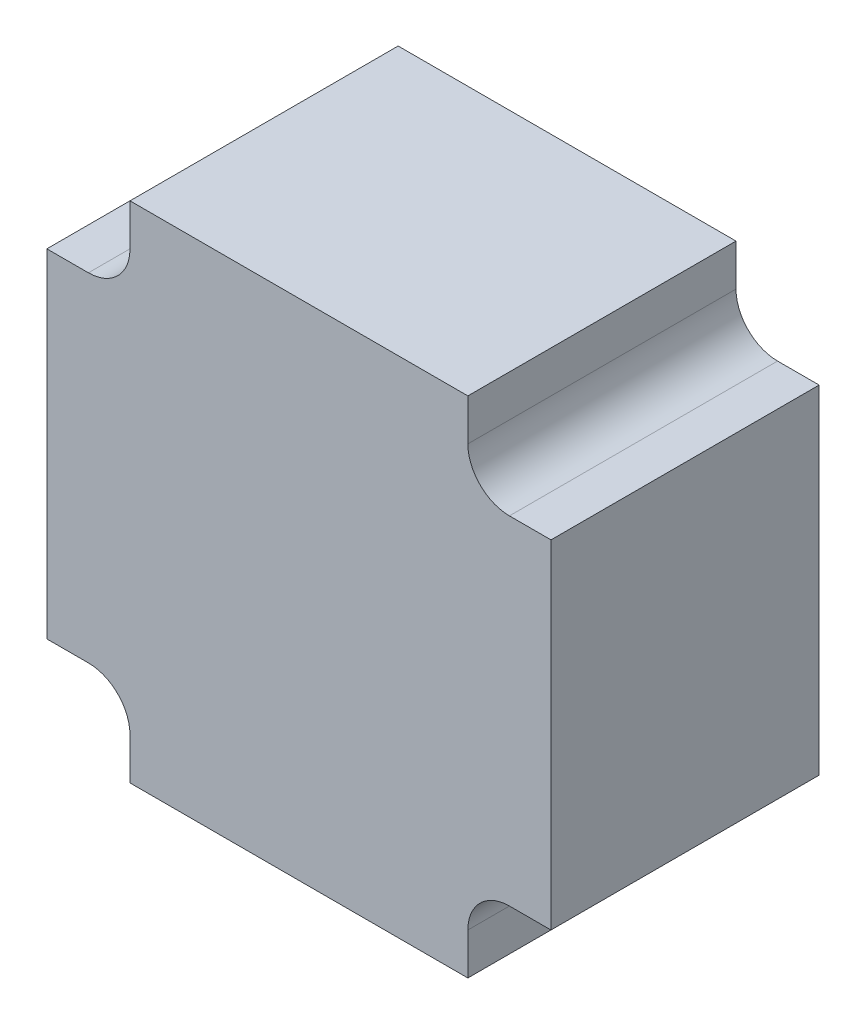
ISO-10303-21;
HEADER;
FILE_DESCRIPTION(('STEP AP214'),'2;1');
FILE_NAME('part.step','',(''),(''),'','','');
FILE_SCHEMA(('AUTOMOTIVE_DESIGN { 1 0 10303 214 1 1 1 1 }'));
ENDSEC;
DATA;
#1=APPLICATION_CONTEXT('core data for automotive mechanical design processes');
#2=APPLICATION_PROTOCOL_DEFINITION('international standard','automotive_design',2000,#1);
#3=PRODUCT_CONTEXT('',#1,'mechanical');
#4=PRODUCT('Part','Part','',(#3));
#5=PRODUCT_RELATED_PRODUCT_CATEGORY('part','',(#4));
#6=PRODUCT_DEFINITION_FORMATION('','',#4);
#7=PRODUCT_DEFINITION_CONTEXT('part definition',#1,'design');
#8=PRODUCT_DEFINITION('design','',#6,#7);
#9=PRODUCT_DEFINITION_SHAPE('','',#8);
#10=(LENGTH_UNIT() NAMED_UNIT(*) SI_UNIT(.MILLI.,.METRE.));
#11=(NAMED_UNIT(*) PLANE_ANGLE_UNIT() SI_UNIT($,.RADIAN.));
#12=(NAMED_UNIT(*) SI_UNIT($,.STERADIAN.) SOLID_ANGLE_UNIT());
#13=UNCERTAINTY_MEASURE_WITH_UNIT(LENGTH_MEASURE(1.E-05),#10,'distance_accuracy_value','');
#14=(GEOMETRIC_REPRESENTATION_CONTEXT(3) GLOBAL_UNCERTAINTY_ASSIGNED_CONTEXT((#13)) GLOBAL_UNIT_ASSIGNED_CONTEXT((#10,
#11,#12)) REPRESENTATION_CONTEXT('',''));
#15=CARTESIAN_POINT('',(0.,0.,0.));
#16=DIRECTION('',(0.,0.,1.));
#17=DIRECTION('',(1.,0.,0.));
#18=AXIS2_PLACEMENT_3D('',#15,#16,#17);
#19=CARTESIAN_POINT('',(28.2,-28.2,-12.));
#20=DIRECTION('',(0.,0.,1.));
#21=DIRECTION('',(1.,0.,0.));
#22=AXIS2_PLACEMENT_3D('',#19,#20,#21);
#23=PLANE('',#22);
#24=DIRECTION('',(1.,0.,0.));
#25=VECTOR('',#24,1.);
#26=CARTESIAN_POINT('',(-28.2,28.2,-12.));
#27=LINE('',#26,#25);
#28=CARTESIAN_POINT('',(-18.9,28.2,-12.));
#29=VERTEX_POINT('',#28);
#30=CARTESIAN_POINT('',(18.9,28.2,-12.));
#31=VERTEX_POINT('',#30);
#32=EDGE_CURVE('E108',#29,#31,#27,.T.);
#33=ORIENTED_EDGE('',*,*,#32,.F.);
#34=DIRECTION('',(0.,1.,0.));
#35=VECTOR('',#34,1.);
#36=CARTESIAN_POINT('',(-18.9,23.55,-12.));
#37=LINE('',#36,#35);
#38=CARTESIAN_POINT('',(-18.9,23.55,-12.));
#39=VERTEX_POINT('',#38);
#40=EDGE_CURVE('E111',#29,#39,#37,.F.);
#41=ORIENTED_EDGE('',*,*,#40,.T.);
#42=CARTESIAN_POINT('',(-23.55,23.55,-12.));
#43=DIRECTION('',(0.,0.,-1.));
#44=DIRECTION('',(-1.,0.,0.));
#45=AXIS2_PLACEMENT_3D('',#42,#43,#44);
#46=CIRCLE('',#45,4.65);
#47=CARTESIAN_POINT('',(-23.55,18.9,-12.));
#48=VERTEX_POINT('',#47);
#49=EDGE_CURVE('E211',#39,#48,#46,.T.);
#50=ORIENTED_EDGE('',*,*,#49,.T.);
#51=DIRECTION('',(1.,0.,0.));
#52=VECTOR('',#51,1.);
#53=CARTESIAN_POINT('',(-23.55,18.9,-12.));
#54=LINE('',#53,#52);
#55=CARTESIAN_POINT('',(-28.2,18.9,-12.));
#56=VERTEX_POINT('',#55);
#57=EDGE_CURVE('E136',#48,#56,#54,.F.);
#58=ORIENTED_EDGE('',*,*,#57,.T.);
#59=DIRECTION('',(0.,1.,0.));
#60=VECTOR('',#59,1.);
#61=CARTESIAN_POINT('',(-28.2,-28.2,-12.));
#62=LINE('',#61,#60);
#63=CARTESIAN_POINT('',(-28.2,-18.9,-12.));
#64=VERTEX_POINT('',#63);
#65=EDGE_CURVE('E140',#64,#56,#62,.T.);
#66=ORIENTED_EDGE('',*,*,#65,.F.);
#67=DIRECTION('',(1.,0.,0.));
#68=VECTOR('',#67,1.);
#69=CARTESIAN_POINT('',(-23.55,-18.9,-12.));
#70=LINE('',#69,#68);
#71=CARTESIAN_POINT('',(-23.55,-18.9,-12.));
#72=VERTEX_POINT('',#71);
#73=EDGE_CURVE('E148',#64,#72,#70,.T.);
#74=ORIENTED_EDGE('',*,*,#73,.T.);
#75=CARTESIAN_POINT('',(-23.55,-23.55,-12.));
#76=DIRECTION('',(0.,0.,-1.));
#77=DIRECTION('',(-1.,0.,0.));
#78=AXIS2_PLACEMENT_3D('',#75,#76,#77);
#79=CIRCLE('',#78,4.65);
#80=CARTESIAN_POINT('',(-18.9,-23.55,-12.));
#81=VERTEX_POINT('',#80);
#82=EDGE_CURVE('E213',#72,#81,#79,.T.);
#83=ORIENTED_EDGE('',*,*,#82,.T.);
#84=DIRECTION('',(0.,1.,0.));
#85=VECTOR('',#84,1.);
#86=CARTESIAN_POINT('',(-18.9,-23.55,-12.));
#87=LINE('',#86,#85);
#88=CARTESIAN_POINT('',(-18.9,-28.2,-12.));
#89=VERTEX_POINT('',#88);
#90=EDGE_CURVE('E154',#81,#89,#87,.F.);
#91=ORIENTED_EDGE('',*,*,#90,.T.);
#92=DIRECTION('',(1.,0.,0.));
#93=VECTOR('',#92,1.);
#94=CARTESIAN_POINT('',(-28.2,-28.2,-12.));
#95=LINE('',#94,#93);
#96=CARTESIAN_POINT('',(18.9,-28.2,-12.));
#97=VERTEX_POINT('',#96);
#98=EDGE_CURVE('E158',#97,#89,#95,.F.);
#99=ORIENTED_EDGE('',*,*,#98,.F.);
#100=DIRECTION('',(0.,1.,0.));
#101=VECTOR('',#100,1.);
#102=CARTESIAN_POINT('',(18.9,-23.55,-12.));
#103=LINE('',#102,#101);
#104=CARTESIAN_POINT('',(18.9,-23.55,-12.));
#105=VERTEX_POINT('',#104);
#106=EDGE_CURVE('E166',#97,#105,#103,.T.);
#107=ORIENTED_EDGE('',*,*,#106,.T.);
#108=CARTESIAN_POINT('',(23.55,-23.55,-12.));
#109=DIRECTION('',(0.,0.,-1.));
#110=DIRECTION('',(-1.,0.,0.));
#111=AXIS2_PLACEMENT_3D('',#108,#109,#110);
#112=CIRCLE('',#111,4.65);
#113=CARTESIAN_POINT('',(23.55,-18.9,-12.));
#114=VERTEX_POINT('',#113);
#115=EDGE_CURVE('E214',#105,#114,#112,.T.);
#116=ORIENTED_EDGE('',*,*,#115,.T.);
#117=DIRECTION('',(1.,0.,0.));
#118=VECTOR('',#117,1.);
#119=CARTESIAN_POINT('',(23.55,-18.9,-12.));
#120=LINE('',#119,#118);
#121=CARTESIAN_POINT('',(28.2,-18.9,-12.));
#122=VERTEX_POINT('',#121);
#123=EDGE_CURVE('E172',#114,#122,#120,.T.);
#124=ORIENTED_EDGE('',*,*,#123,.T.);
#125=DIRECTION('',(0.,1.,0.));
#126=VECTOR('',#125,1.);
#127=CARTESIAN_POINT('',(28.2,-28.2,-12.));
#128=LINE('',#127,#126);
#129=CARTESIAN_POINT('',(28.2,18.9,-12.));
#130=VERTEX_POINT('',#129);
#131=EDGE_CURVE('E176',#130,#122,#128,.F.);
#132=ORIENTED_EDGE('',*,*,#131,.F.);
#133=DIRECTION('',(1.,0.,0.));
#134=VECTOR('',#133,1.);
#135=CARTESIAN_POINT('',(23.55,18.9,-12.));
#136=LINE('',#135,#134);
#137=CARTESIAN_POINT('',(23.55,18.9,-12.));
#138=VERTEX_POINT('',#137);
#139=EDGE_CURVE('E97',#130,#138,#136,.F.);
#140=ORIENTED_EDGE('',*,*,#139,.T.);
#141=CARTESIAN_POINT('',(23.55,23.55,-12.));
#142=DIRECTION('',(0.,0.,-1.));
#143=DIRECTION('',(-1.,0.,0.));
#144=AXIS2_PLACEMENT_3D('',#141,#142,#143);
#145=CIRCLE('',#144,4.65);
#146=CARTESIAN_POINT('',(18.9,23.55,-12.));
#147=VERTEX_POINT('',#146);
#148=EDGE_CURVE('E20',#138,#147,#145,.T.);
#149=ORIENTED_EDGE('',*,*,#148,.T.);
#150=DIRECTION('',(0.,1.,0.));
#151=VECTOR('',#150,1.);
#152=CARTESIAN_POINT('',(18.9,23.55,-12.));
#153=LINE('',#152,#151);
#154=EDGE_CURVE('E105',#147,#31,#153,.T.);
#155=ORIENTED_EDGE('',*,*,#154,.T.);
#156=EDGE_LOOP('',(#33,#41,#50,#58,#66,#74,#83,#91,#99,#107,#116,#124,#132,#140,#149,#155));
#157=FACE_BOUND('',#156,.T.);
#158=ADVANCED_FACE('F17',(#157),#23,.T.);
#159=CARTESIAN_POINT('',(-28.2,28.2,-54.));
#160=DIRECTION('',(0.,1.,0.));
#161=DIRECTION('',(0.,0.,1.));
#162=AXIS2_PLACEMENT_3D('',#159,#160,#161);
#163=PLANE('',#162);
#164=ORIENTED_EDGE('',*,*,#32,.T.);
#165=DIRECTION('',(0.,0.,1.));
#166=VECTOR('',#165,1.);
#167=CARTESIAN_POINT('',(18.9,28.2,-4.8));
#168=LINE('',#167,#166);
#169=CARTESIAN_POINT('',(18.9,28.2,-42.));
#170=VERTEX_POINT('',#169);
#171=EDGE_CURVE('E190',#31,#170,#168,.F.);
#172=ORIENTED_EDGE('',*,*,#171,.T.);
#173=DIRECTION('',(-1.,0.,0.));
#174=VECTOR('',#173,1.);
#175=CARTESIAN_POINT('',(28.2,28.2,-42.));
#176=LINE('',#175,#174);
#177=CARTESIAN_POINT('',(-18.9,28.2,-42.));
#178=VERTEX_POINT('',#177);
#179=EDGE_CURVE('E121',#178,#170,#176,.F.);
#180=ORIENTED_EDGE('',*,*,#179,.F.);
#181=DIRECTION('',(0.,0.,-1.));
#182=VECTOR('',#181,1.);
#183=CARTESIAN_POINT('',(-18.9,28.2,-4.8));
#184=LINE('',#183,#182);
#185=EDGE_CURVE('E118',#178,#29,#184,.F.);
#186=ORIENTED_EDGE('',*,*,#185,.T.);
#187=EDGE_LOOP('',(#164,#172,#180,#186));
#188=FACE_BOUND('',#187,.T.);
#189=ADVANCED_FACE('F119',(#188),#163,.T.);
#190=CARTESIAN_POINT('',(18.9,23.55,-4.8));
#191=DIRECTION('',(-1.,0.,0.));
#192=DIRECTION('',(0.,0.,1.));
#193=AXIS2_PLACEMENT_3D('',#190,#191,#192);
#194=PLANE('',#193);
#195=ORIENTED_EDGE('',*,*,#154,.F.);
#196=DIRECTION('',(0.,0.,-1.));
#197=VECTOR('',#196,1.);
#198=CARTESIAN_POINT('',(18.9,23.55,-4.8));
#199=LINE('',#198,#197);
#200=CARTESIAN_POINT('',(18.9,23.55,-42.));
#201=VERTEX_POINT('',#200);
#202=EDGE_CURVE('E186',#147,#201,#199,.T.);
#203=ORIENTED_EDGE('',*,*,#202,.T.);
#204=DIRECTION('',(0.,1.,0.));
#205=VECTOR('',#204,1.);
#206=CARTESIAN_POINT('',(18.9,-28.2,-42.));
#207=LINE('',#206,#205);
#208=EDGE_CURVE('E210',#170,#201,#207,.F.);
#209=ORIENTED_EDGE('',*,*,#208,.F.);
#210=ORIENTED_EDGE('',*,*,#171,.F.);
#211=EDGE_LOOP('',(#195,#203,#209,#210));
#212=FACE_BOUND('',#211,.T.);
#213=ADVANCED_FACE('F241',(#212),#194,.F.);
#214=CARTESIAN_POINT('',(23.55,23.55,-4.8));
#215=DIRECTION('',(0.,0.,-1.));
#216=DIRECTION('',(-1.,0.,0.));
#217=AXIS2_PLACEMENT_3D('',#214,#215,#216);
#218=CYLINDRICAL_SURFACE('',#217,4.65);
#219=ORIENTED_EDGE('',*,*,#148,.F.);
#220=DIRECTION('',(0.,0.,-1.));
#221=VECTOR('',#220,1.);
#222=CARTESIAN_POINT('',(23.55,18.9,-4.8));
#223=LINE('',#222,#221);
#224=CARTESIAN_POINT('',(23.55,18.9,-42.));
#225=VERTEX_POINT('',#224);
#226=EDGE_CURVE('E185',#138,#225,#223,.T.);
#227=ORIENTED_EDGE('',*,*,#226,.T.);
#228=CARTESIAN_POINT('',(23.55,23.55,-42.));
#229=DIRECTION('',(0.,0.,-1.));
#230=DIRECTION('',(-1.,0.,0.));
#231=AXIS2_PLACEMENT_3D('',#228,#229,#230);
#232=CIRCLE('',#231,4.65);
#233=EDGE_CURVE('E206',#201,#225,#232,.F.);
#234=ORIENTED_EDGE('',*,*,#233,.F.);
#235=ORIENTED_EDGE('',*,*,#202,.F.);
#236=EDGE_LOOP('',(#219,#227,#234,#235));
#237=FACE_BOUND('',#236,.T.);
#238=ADVANCED_FACE('F323',(#237),#218,.F.);
#239=CARTESIAN_POINT('',(23.55,18.9,-4.8));
#240=DIRECTION('',(0.,-1.,0.));
#241=DIRECTION('',(0.,0.,-1.));
#242=AXIS2_PLACEMENT_3D('',#239,#240,#241);
#243=PLANE('',#242);
#244=ORIENTED_EDGE('',*,*,#139,.F.);
#245=DIRECTION('',(0.,0.,-1.));
#246=VECTOR('',#245,1.);
#247=CARTESIAN_POINT('',(28.2,18.9,-54.));
#248=LINE('',#247,#246);
#249=CARTESIAN_POINT('',(28.2,18.9,-42.));
#250=VERTEX_POINT('',#249);
#251=EDGE_CURVE('E181',#250,#130,#248,.F.);
#252=ORIENTED_EDGE('',*,*,#251,.F.);
#253=DIRECTION('',(-1.,0.,0.));
#254=VECTOR('',#253,1.);
#255=CARTESIAN_POINT('',(28.2,18.9,-42.));
#256=LINE('',#255,#254);
#257=EDGE_CURVE('E209',#225,#250,#256,.F.);
#258=ORIENTED_EDGE('',*,*,#257,.F.);
#259=ORIENTED_EDGE('',*,*,#226,.F.);
#260=EDGE_LOOP('',(#244,#252,#258,#259));
#261=FACE_BOUND('',#260,.T.);
#262=ADVANCED_FACE('F312',(#261),#243,.F.);
#263=CARTESIAN_POINT('',(28.2,-28.2,-54.));
#264=DIRECTION('',(1.,0.,0.));
#265=DIRECTION('',(0.,0.,-1.));
#266=AXIS2_PLACEMENT_3D('',#263,#264,#265);
#267=PLANE('',#266);
#268=ORIENTED_EDGE('',*,*,#131,.T.);
#269=DIRECTION('',(0.,0.,1.));
#270=VECTOR('',#269,1.);
#271=CARTESIAN_POINT('',(28.2,-18.9,-4.8));
#272=LINE('',#271,#270);
#273=CARTESIAN_POINT('',(28.2,-18.9,-42.));
#274=VERTEX_POINT('',#273);
#275=EDGE_CURVE('E175',#122,#274,#272,.F.);
#276=ORIENTED_EDGE('',*,*,#275,.T.);
#277=DIRECTION('',(0.,1.,0.));
#278=VECTOR('',#277,1.);
#279=CARTESIAN_POINT('',(28.2,-28.2,-42.));
#280=LINE('',#279,#278);
#281=EDGE_CURVE('E228',#250,#274,#280,.F.);
#282=ORIENTED_EDGE('',*,*,#281,.F.);
#283=ORIENTED_EDGE('',*,*,#251,.T.);
#284=EDGE_LOOP('',(#268,#276,#282,#283));
#285=FACE_BOUND('',#284,.T.);
#286=ADVANCED_FACE('F313',(#285),#267,.T.);
#287=CARTESIAN_POINT('',(23.55,-18.9,-4.8));
#288=DIRECTION('',(0.,1.,0.));
#289=DIRECTION('',(0.,0.,1.));
#290=AXIS2_PLACEMENT_3D('',#287,#288,#289);
#291=PLANE('',#290);
#292=ORIENTED_EDGE('',*,*,#123,.F.);
#293=DIRECTION('',(0.,0.,-1.));
#294=VECTOR('',#293,1.);
#295=CARTESIAN_POINT('',(23.55,-18.9,-4.8));
#296=LINE('',#295,#294);
#297=CARTESIAN_POINT('',(23.55,-18.9,-42.));
#298=VERTEX_POINT('',#297);
#299=EDGE_CURVE('E169',#114,#298,#296,.T.);
#300=ORIENTED_EDGE('',*,*,#299,.T.);
#301=DIRECTION('',(-1.,0.,0.));
#302=VECTOR('',#301,1.);
#303=CARTESIAN_POINT('',(28.2,-18.9,-42.));
#304=LINE('',#303,#302);
#305=EDGE_CURVE('E205',#274,#298,#304,.T.);
#306=ORIENTED_EDGE('',*,*,#305,.F.);
#307=ORIENTED_EDGE('',*,*,#275,.F.);
#308=EDGE_LOOP('',(#292,#300,#306,#307));
#309=FACE_BOUND('',#308,.T.);
#310=ADVANCED_FACE('F315',(#309),#291,.F.);
#311=CARTESIAN_POINT('',(23.55,-23.55,-4.8));
#312=DIRECTION('',(0.,0.,-1.));
#313=DIRECTION('',(-1.,0.,0.));
#314=AXIS2_PLACEMENT_3D('',#311,#312,#313);
#315=CYLINDRICAL_SURFACE('',#314,4.65);
#316=ORIENTED_EDGE('',*,*,#115,.F.);
#317=DIRECTION('',(0.,0.,1.));
#318=VECTOR('',#317,1.);
#319=CARTESIAN_POINT('',(18.9,-23.55,-4.8));
#320=LINE('',#319,#318);
#321=CARTESIAN_POINT('',(18.9,-23.55,-42.));
#322=VERTEX_POINT('',#321);
#323=EDGE_CURVE('E168',#105,#322,#320,.F.);
#324=ORIENTED_EDGE('',*,*,#323,.T.);
#325=CARTESIAN_POINT('',(23.55,-23.55,-42.));
#326=DIRECTION('',(0.,0.,-1.));
#327=DIRECTION('',(-1.,0.,0.));
#328=AXIS2_PLACEMENT_3D('',#325,#326,#327);
#329=CIRCLE('',#328,4.65);
#330=EDGE_CURVE('E201',#298,#322,#329,.F.);
#331=ORIENTED_EDGE('',*,*,#330,.F.);
#332=ORIENTED_EDGE('',*,*,#299,.F.);
#333=EDGE_LOOP('',(#316,#324,#331,#332));
#334=FACE_BOUND('',#333,.T.);
#335=ADVANCED_FACE('F285',(#334),#315,.F.);
#336=CARTESIAN_POINT('',(18.9,-23.55,-4.8));
#337=DIRECTION('',(-1.,0.,0.));
#338=DIRECTION('',(0.,0.,1.));
#339=AXIS2_PLACEMENT_3D('',#336,#337,#338);
#340=PLANE('',#339);
#341=ORIENTED_EDGE('',*,*,#106,.F.);
#342=DIRECTION('',(0.,0.,-1.));
#343=VECTOR('',#342,1.);
#344=CARTESIAN_POINT('',(18.9,-28.2,-54.));
#345=LINE('',#344,#343);
#346=CARTESIAN_POINT('',(18.9,-28.2,-42.));
#347=VERTEX_POINT('',#346);
#348=EDGE_CURVE('E163',#347,#97,#345,.F.);
#349=ORIENTED_EDGE('',*,*,#348,.F.);
#350=DIRECTION('',(0.,1.,0.));
#351=VECTOR('',#350,1.);
#352=CARTESIAN_POINT('',(18.9,-28.2,-42.));
#353=LINE('',#352,#351);
#354=EDGE_CURVE('E204',#322,#347,#353,.F.);
#355=ORIENTED_EDGE('',*,*,#354,.F.);
#356=ORIENTED_EDGE('',*,*,#323,.F.);
#357=EDGE_LOOP('',(#341,#349,#355,#356));
#358=FACE_BOUND('',#357,.T.);
#359=ADVANCED_FACE('F292',(#358),#340,.F.);
#360=CARTESIAN_POINT('',(-28.2,-28.2,-54.));
#361=DIRECTION('',(0.,-1.,0.));
#362=DIRECTION('',(0.,0.,-1.));
#363=AXIS2_PLACEMENT_3D('',#360,#361,#362);
#364=PLANE('',#363);
#365=ORIENTED_EDGE('',*,*,#98,.T.);
#366=DIRECTION('',(0.,0.,-1.));
#367=VECTOR('',#366,1.);
#368=CARTESIAN_POINT('',(-18.9,-28.2,-4.8));
#369=LINE('',#368,#367);
#370=CARTESIAN_POINT('',(-18.9,-28.2,-42.));
#371=VERTEX_POINT('',#370);
#372=EDGE_CURVE('E157',#89,#371,#369,.T.);
#373=ORIENTED_EDGE('',*,*,#372,.T.);
#374=DIRECTION('',(-1.,0.,0.));
#375=VECTOR('',#374,1.);
#376=CARTESIAN_POINT('',(28.2,-28.2,-42.));
#377=LINE('',#376,#375);
#378=EDGE_CURVE('E273',#347,#371,#377,.T.);
#379=ORIENTED_EDGE('',*,*,#378,.F.);
#380=ORIENTED_EDGE('',*,*,#348,.T.);
#381=EDGE_LOOP('',(#365,#373,#379,#380));
#382=FACE_BOUND('',#381,.T.);
#383=ADVANCED_FACE('F354',(#382),#364,.T.);
#384=CARTESIAN_POINT('',(-18.9,-23.55,-4.8));
#385=DIRECTION('',(1.,0.,0.));
#386=DIRECTION('',(0.,0.,-1.));
#387=AXIS2_PLACEMENT_3D('',#384,#385,#386);
#388=PLANE('',#387);
#389=ORIENTED_EDGE('',*,*,#90,.F.);
#390=DIRECTION('',(0.,0.,-1.));
#391=VECTOR('',#390,1.);
#392=CARTESIAN_POINT('',(-18.9,-23.55,-4.8));
#393=LINE('',#392,#391);
#394=CARTESIAN_POINT('',(-18.9,-23.55,-42.));
#395=VERTEX_POINT('',#394);
#396=EDGE_CURVE('E151',#81,#395,#393,.T.);
#397=ORIENTED_EDGE('',*,*,#396,.T.);
#398=DIRECTION('',(0.,1.,0.));
#399=VECTOR('',#398,1.);
#400=CARTESIAN_POINT('',(-18.9,-28.2,-42.));
#401=LINE('',#400,#399);
#402=EDGE_CURVE('E200',#371,#395,#401,.T.);
#403=ORIENTED_EDGE('',*,*,#402,.F.);
#404=ORIENTED_EDGE('',*,*,#372,.F.);
#405=EDGE_LOOP('',(#389,#397,#403,#404));
#406=FACE_BOUND('',#405,.T.);
#407=ADVANCED_FACE('F350',(#406),#388,.F.);
#408=CARTESIAN_POINT('',(-23.55,-23.55,-4.8));
#409=DIRECTION('',(0.,0.,-1.));
#410=DIRECTION('',(-1.,0.,0.));
#411=AXIS2_PLACEMENT_3D('',#408,#409,#410);
#412=CYLINDRICAL_SURFACE('',#411,4.65);
#413=ORIENTED_EDGE('',*,*,#82,.F.);
#414=DIRECTION('',(0.,0.,1.));
#415=VECTOR('',#414,1.);
#416=CARTESIAN_POINT('',(-23.55,-18.9,-4.8));
#417=LINE('',#416,#415);
#418=CARTESIAN_POINT('',(-23.55,-18.9,-42.));
#419=VERTEX_POINT('',#418);
#420=EDGE_CURVE('E150',#72,#419,#417,.F.);
#421=ORIENTED_EDGE('',*,*,#420,.T.);
#422=CARTESIAN_POINT('',(-23.55,-23.55,-42.));
#423=DIRECTION('',(0.,0.,-1.));
#424=DIRECTION('',(-1.,0.,0.));
#425=AXIS2_PLACEMENT_3D('',#422,#423,#424);
#426=CIRCLE('',#425,4.65);
#427=EDGE_CURVE('E196',#395,#419,#426,.F.);
#428=ORIENTED_EDGE('',*,*,#427,.F.);
#429=ORIENTED_EDGE('',*,*,#396,.F.);
#430=EDGE_LOOP('',(#413,#421,#428,#429));
#431=FACE_BOUND('',#430,.T.);
#432=ADVANCED_FACE('F346',(#431),#412,.F.);
#433=CARTESIAN_POINT('',(-23.55,-18.9,-4.8));
#434=DIRECTION('',(0.,1.,0.));
#435=DIRECTION('',(0.,0.,1.));
#436=AXIS2_PLACEMENT_3D('',#433,#434,#435);
#437=PLANE('',#436);
#438=ORIENTED_EDGE('',*,*,#73,.F.);
#439=DIRECTION('',(0.,0.,1.));
#440=VECTOR('',#439,1.);
#441=CARTESIAN_POINT('',(-28.2,-18.9,-54.));
#442=LINE('',#441,#440);
#443=CARTESIAN_POINT('',(-28.2,-18.9,-42.));
#444=VERTEX_POINT('',#443);
#445=EDGE_CURVE('E145',#444,#64,#442,.T.);
#446=ORIENTED_EDGE('',*,*,#445,.F.);
#447=DIRECTION('',(-1.,0.,0.));
#448=VECTOR('',#447,1.);
#449=CARTESIAN_POINT('',(28.2,-18.9,-42.));
#450=LINE('',#449,#448);
#451=EDGE_CURVE('E199',#419,#444,#450,.T.);
#452=ORIENTED_EDGE('',*,*,#451,.F.);
#453=ORIENTED_EDGE('',*,*,#420,.F.);
#454=EDGE_LOOP('',(#438,#446,#452,#453));
#455=FACE_BOUND('',#454,.T.);
#456=ADVANCED_FACE('F342',(#455),#437,.F.);
#457=CARTESIAN_POINT('',(-28.2,-28.2,-54.));
#458=DIRECTION('',(-1.,0.,0.));
#459=DIRECTION('',(0.,0.,1.));
#460=AXIS2_PLACEMENT_3D('',#457,#458,#459);
#461=PLANE('',#460);
#462=ORIENTED_EDGE('',*,*,#65,.T.);
#463=DIRECTION('',(0.,0.,-1.));
#464=VECTOR('',#463,1.);
#465=CARTESIAN_POINT('',(-28.2,18.9,-4.8));
#466=LINE('',#465,#464);
#467=CARTESIAN_POINT('',(-28.2,18.9,-42.));
#468=VERTEX_POINT('',#467);
#469=EDGE_CURVE('E139',#56,#468,#466,.T.);
#470=ORIENTED_EDGE('',*,*,#469,.T.);
#471=DIRECTION('',(0.,1.,0.));
#472=VECTOR('',#471,1.);
#473=CARTESIAN_POINT('',(-28.2,-28.2,-42.));
#474=LINE('',#473,#472);
#475=EDGE_CURVE('E258',#444,#468,#474,.T.);
#476=ORIENTED_EDGE('',*,*,#475,.F.);
#477=ORIENTED_EDGE('',*,*,#445,.T.);
#478=EDGE_LOOP('',(#462,#470,#476,#477));
#479=FACE_BOUND('',#478,.T.);
#480=ADVANCED_FACE('F338',(#479),#461,.T.);
#481=CARTESIAN_POINT('',(-23.55,18.9,-4.8));
#482=DIRECTION('',(0.,-1.,0.));
#483=DIRECTION('',(0.,0.,-1.));
#484=AXIS2_PLACEMENT_3D('',#481,#482,#483);
#485=PLANE('',#484);
#486=ORIENTED_EDGE('',*,*,#57,.F.);
#487=DIRECTION('',(0.,0.,-1.));
#488=VECTOR('',#487,1.);
#489=CARTESIAN_POINT('',(-23.55,18.9,-4.8));
#490=LINE('',#489,#488);
#491=CARTESIAN_POINT('',(-23.55,18.9,-42.));
#492=VERTEX_POINT('',#491);
#493=EDGE_CURVE('E123',#48,#492,#490,.T.);
#494=ORIENTED_EDGE('',*,*,#493,.T.);
#495=DIRECTION('',(-1.,0.,0.));
#496=VECTOR('',#495,1.);
#497=CARTESIAN_POINT('',(28.2,18.9,-42.));
#498=LINE('',#497,#496);
#499=EDGE_CURVE('E195',#468,#492,#498,.F.);
#500=ORIENTED_EDGE('',*,*,#499,.F.);
#501=ORIENTED_EDGE('',*,*,#469,.F.);
#502=EDGE_LOOP('',(#486,#494,#500,#501));
#503=FACE_BOUND('',#502,.T.);
#504=ADVANCED_FACE('F335',(#503),#485,.F.);
#505=CARTESIAN_POINT('',(-23.55,23.55,-4.8));
#506=DIRECTION('',(0.,0.,-1.));
#507=DIRECTION('',(-1.,0.,0.));
#508=AXIS2_PLACEMENT_3D('',#505,#506,#507);
#509=CYLINDRICAL_SURFACE('',#508,4.65);
#510=ORIENTED_EDGE('',*,*,#49,.F.);
#511=DIRECTION('',(0.,0.,-1.));
#512=VECTOR('',#511,1.);
#513=CARTESIAN_POINT('',(-18.9,23.55,-4.8));
#514=LINE('',#513,#512);
#515=CARTESIAN_POINT('',(-18.9,23.55,-42.));
#516=VERTEX_POINT('',#515);
#517=EDGE_CURVE('E35',#39,#516,#514,.T.);
#518=ORIENTED_EDGE('',*,*,#517,.T.);
#519=CARTESIAN_POINT('',(-23.55,23.55,-42.));
#520=DIRECTION('',(0.,0.,-1.));
#521=DIRECTION('',(-1.,0.,0.));
#522=AXIS2_PLACEMENT_3D('',#519,#520,#521);
#523=CIRCLE('',#522,4.65);
#524=EDGE_CURVE('E26',#492,#516,#523,.F.);
#525=ORIENTED_EDGE('',*,*,#524,.F.);
#526=ORIENTED_EDGE('',*,*,#493,.F.);
#527=EDGE_LOOP('',(#510,#518,#525,#526));
#528=FACE_BOUND('',#527,.T.);
#529=ADVANCED_FACE('F330',(#528),#509,.F.);
#530=CARTESIAN_POINT('',(-18.9,23.55,-4.8));
#531=DIRECTION('',(1.,0.,0.));
#532=DIRECTION('',(0.,0.,-1.));
#533=AXIS2_PLACEMENT_3D('',#530,#531,#532);
#534=PLANE('',#533);
#535=ORIENTED_EDGE('',*,*,#40,.F.);
#536=ORIENTED_EDGE('',*,*,#185,.F.);
#537=DIRECTION('',(0.,1.,0.));
#538=VECTOR('',#537,1.);
#539=CARTESIAN_POINT('',(-18.9,-28.2,-42.));
#540=LINE('',#539,#538);
#541=EDGE_CURVE('E11',#516,#178,#540,.T.);
#542=ORIENTED_EDGE('',*,*,#541,.F.);
#543=ORIENTED_EDGE('',*,*,#517,.F.);
#544=EDGE_LOOP('',(#535,#536,#542,#543));
#545=FACE_BOUND('',#544,.T.);
#546=ADVANCED_FACE('F125',(#545),#534,.F.);
#547=CARTESIAN_POINT('',(28.2,-28.2,-42.));
#548=DIRECTION('',(0.,0.,-1.));
#549=DIRECTION('',(-1.,0.,0.));
#550=AXIS2_PLACEMENT_3D('',#547,#548,#549);
#551=PLANE('',#550);
#552=ORIENTED_EDGE('',*,*,#524,.T.);
#553=ORIENTED_EDGE('',*,*,#541,.T.);
#554=ORIENTED_EDGE('',*,*,#179,.T.);
#555=ORIENTED_EDGE('',*,*,#208,.T.);
#556=ORIENTED_EDGE('',*,*,#233,.T.);
#557=ORIENTED_EDGE('',*,*,#257,.T.);
#558=ORIENTED_EDGE('',*,*,#281,.T.);
#559=ORIENTED_EDGE('',*,*,#305,.T.);
#560=ORIENTED_EDGE('',*,*,#330,.T.);
#561=ORIENTED_EDGE('',*,*,#354,.T.);
#562=ORIENTED_EDGE('',*,*,#378,.T.);
#563=ORIENTED_EDGE('',*,*,#402,.T.);
#564=ORIENTED_EDGE('',*,*,#427,.T.);
#565=ORIENTED_EDGE('',*,*,#451,.T.);
#566=ORIENTED_EDGE('',*,*,#475,.T.);
#567=ORIENTED_EDGE('',*,*,#499,.T.);
#568=EDGE_LOOP('',(#552,#553,#554,#555,#556,#557,#558,#559,#560,#561,#562,#563,#564,#565,#566,#567));
#569=FACE_BOUND('',#568,.T.);
#570=ADVANCED_FACE('F246',(#569),#551,.T.);
#571=CLOSED_SHELL('',(#158,#189,#213,#238,#262,#286,#310,#335,#359,#383,#407,#432,#456,#480,
#504,#529,#546,#570));
#572=MANIFOLD_SOLID_BREP('B1',#571);
#573=ADVANCED_BREP_SHAPE_REPRESENTATION('',(#18,#572),#14);
#574=SHAPE_DEFINITION_REPRESENTATION(#9,#573);
ENDSEC;
END-ISO-10303-21;
